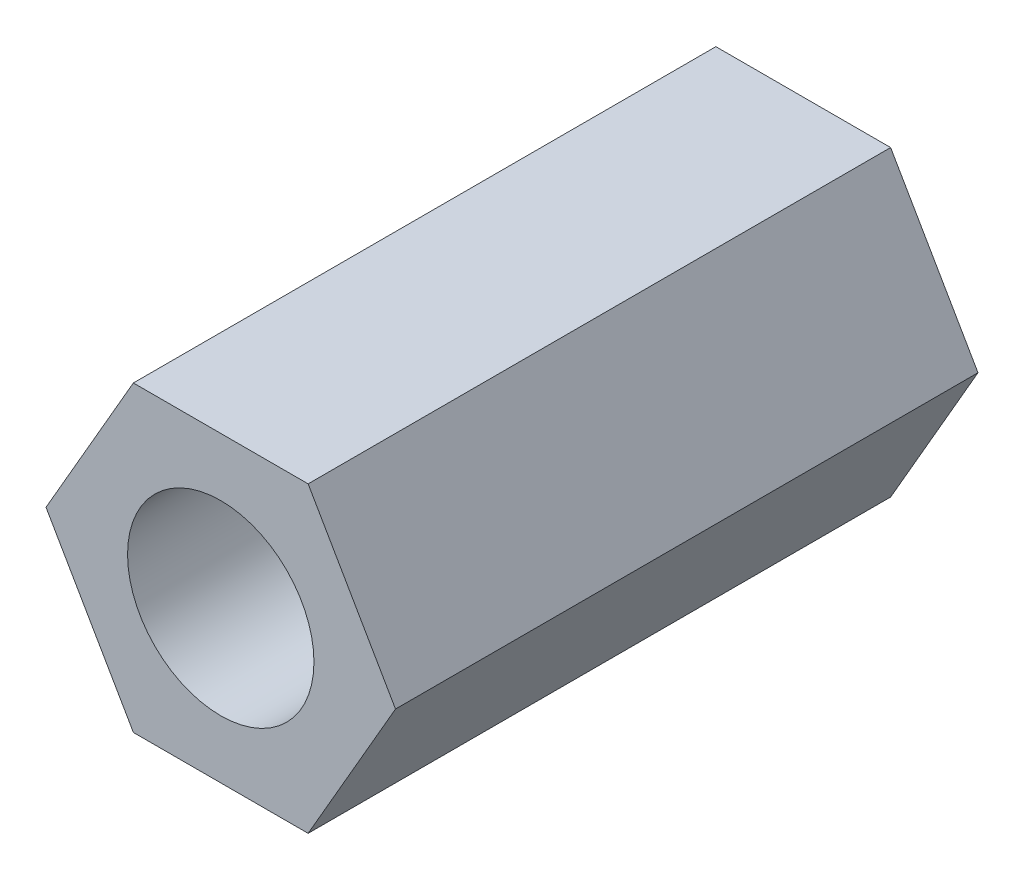
ISO-10303-21;
HEADER;
FILE_DESCRIPTION(('STEP AP214'),'2;1');
FILE_NAME('part.step','',(''),(''),'','','');
FILE_SCHEMA(('AUTOMOTIVE_DESIGN { 1 0 10303 214 1 1 1 1 }'));
ENDSEC;
DATA;
#1=APPLICATION_CONTEXT('core data for automotive mechanical design processes');
#2=APPLICATION_PROTOCOL_DEFINITION('international standard','automotive_design',2000,#1);
#3=PRODUCT_CONTEXT('',#1,'mechanical');
#4=PRODUCT('Part','Part','',(#3));
#5=PRODUCT_RELATED_PRODUCT_CATEGORY('part','',(#4));
#6=PRODUCT_DEFINITION_FORMATION('','',#4);
#7=PRODUCT_DEFINITION_CONTEXT('part definition',#1,'design');
#8=PRODUCT_DEFINITION('design','',#6,#7);
#9=PRODUCT_DEFINITION_SHAPE('','',#8);
#10=(LENGTH_UNIT() NAMED_UNIT(*) SI_UNIT(.MILLI.,.METRE.));
#11=(NAMED_UNIT(*) PLANE_ANGLE_UNIT() SI_UNIT($,.RADIAN.));
#12=(NAMED_UNIT(*) SI_UNIT($,.STERADIAN.) SOLID_ANGLE_UNIT());
#13=UNCERTAINTY_MEASURE_WITH_UNIT(LENGTH_MEASURE(1.E-05),#10,'distance_accuracy_value','');
#14=(GEOMETRIC_REPRESENTATION_CONTEXT(3) GLOBAL_UNCERTAINTY_ASSIGNED_CONTEXT((#13)) GLOBAL_UNIT_ASSIGNED_CONTEXT((#10,
#11,#12)) REPRESENTATION_CONTEXT('',''));
#15=CARTESIAN_POINT('',(0.,0.,0.));
#16=DIRECTION('',(0.,0.,1.));
#17=DIRECTION('',(1.,0.,0.));
#18=AXIS2_PLACEMENT_3D('',#15,#16,#17);
#19=CARTESIAN_POINT('',(0.,0.,10.));
#20=DIRECTION('',(0.,0.,1.));
#21=DIRECTION('',(1.,0.,0.));
#22=AXIS2_PLACEMENT_3D('',#19,#20,#21);
#23=PLANE('',#22);
#24=DIRECTION('',(0.5,0.866025403784438,0.));
#25=VECTOR('',#24,1.);
#26=CARTESIAN_POINT('',(1.5,-2.59807621135332,10.));
#27=LINE('',#26,#25);
#28=CARTESIAN_POINT('',(1.5,-2.59807621135332,10.));
#29=VERTEX_POINT('',#28);
#30=CARTESIAN_POINT('',(3.,0.,10.));
#31=VERTEX_POINT('',#30);
#32=EDGE_CURVE('E150',#29,#31,#27,.T.);
#33=ORIENTED_EDGE('',*,*,#32,.T.);
#34=DIRECTION('',(-0.5,0.866025403784439,0.));
#35=VECTOR('',#34,1.);
#36=CARTESIAN_POINT('',(3.,0.,10.));
#37=LINE('',#36,#35);
#38=CARTESIAN_POINT('',(1.5,2.59807621135332,10.));
#39=VERTEX_POINT('',#38);
#40=EDGE_CURVE('E98',#31,#39,#37,.T.);
#41=ORIENTED_EDGE('',*,*,#40,.T.);
#42=DIRECTION('',(-1.,0.,0.));
#43=VECTOR('',#42,1.);
#44=CARTESIAN_POINT('',(1.5,2.59807621135332,10.));
#45=LINE('',#44,#43);
#46=CARTESIAN_POINT('',(-1.5,2.59807621135332,10.));
#47=VERTEX_POINT('',#46);
#48=EDGE_CURVE('E111',#39,#47,#45,.T.);
#49=ORIENTED_EDGE('',*,*,#48,.T.);
#50=DIRECTION('',(-0.5,-0.866025403784439,0.));
#51=VECTOR('',#50,1.);
#52=CARTESIAN_POINT('',(-1.5,2.59807621135332,10.));
#53=LINE('',#52,#51);
#54=CARTESIAN_POINT('',(-3.,0.,10.));
#55=VERTEX_POINT('',#54);
#56=EDGE_CURVE('E105',#47,#55,#53,.T.);
#57=ORIENTED_EDGE('',*,*,#56,.T.);
#58=DIRECTION('',(0.5,-0.866025403784439,0.));
#59=VECTOR('',#58,1.);
#60=CARTESIAN_POINT('',(-3.,0.,10.));
#61=LINE('',#60,#59);
#62=CARTESIAN_POINT('',(-1.5,-2.59807621135332,10.));
#63=VERTEX_POINT('',#62);
#64=EDGE_CURVE('E109',#55,#63,#61,.T.);
#65=ORIENTED_EDGE('',*,*,#64,.T.);
#66=DIRECTION('',(1.,0.,0.));
#67=VECTOR('',#66,1.);
#68=CARTESIAN_POINT('',(-1.5,-2.59807621135332,10.));
#69=LINE('',#68,#67);
#70=EDGE_CURVE('E61',#63,#29,#69,.T.);
#71=ORIENTED_EDGE('',*,*,#70,.T.);
#72=EDGE_LOOP('',(#33,#41,#49,#57,#65,#71));
#73=FACE_BOUND('',#72,.T.);
#74=CARTESIAN_POINT('',(0.,0.,10.));
#75=DIRECTION('',(0.,0.,1.));
#76=DIRECTION('',(1.,0.,0.));
#77=AXIS2_PLACEMENT_3D('',#74,#75,#76);
#78=CIRCLE('',#77,1.6);
#79=CARTESIAN_POINT('',(1.6,0.,10.));
#80=VERTEX_POINT('',#79);
#81=EDGE_CURVE('E138',#80,#80,#78,.T.);
#82=ORIENTED_EDGE('',*,*,#81,.F.);
#83=EDGE_LOOP('',(#82));
#84=FACE_BOUND('',#83,.T.);
#85=ADVANCED_FACE('F43',(#73,#84),#23,.T.);
#86=CARTESIAN_POINT('',(0.,0.,0.));
#87=DIRECTION('',(0.,0.,1.));
#88=DIRECTION('',(1.,0.,0.));
#89=AXIS2_PLACEMENT_3D('',#86,#87,#88);
#90=PLANE('',#89);
#91=DIRECTION('',(0.5,0.866025403784438,0.));
#92=VECTOR('',#91,1.);
#93=CARTESIAN_POINT('',(1.5,-2.59807621135332,0.));
#94=LINE('',#93,#92);
#95=CARTESIAN_POINT('',(1.5,-2.59807621135332,0.));
#96=VERTEX_POINT('',#95);
#97=CARTESIAN_POINT('',(3.,0.,0.));
#98=VERTEX_POINT('',#97);
#99=EDGE_CURVE('E133',#96,#98,#94,.T.);
#100=ORIENTED_EDGE('',*,*,#99,.F.);
#101=DIRECTION('',(1.,0.,0.));
#102=VECTOR('',#101,1.);
#103=CARTESIAN_POINT('',(-1.5,-2.59807621135332,0.));
#104=LINE('',#103,#102);
#105=CARTESIAN_POINT('',(-1.5,-2.59807621135332,0.));
#106=VERTEX_POINT('',#105);
#107=EDGE_CURVE('E90',#106,#96,#104,.T.);
#108=ORIENTED_EDGE('',*,*,#107,.F.);
#109=DIRECTION('',(0.5,-0.866025403784439,0.));
#110=VECTOR('',#109,1.);
#111=CARTESIAN_POINT('',(-3.,0.,0.));
#112=LINE('',#111,#110);
#113=CARTESIAN_POINT('',(-3.,0.,0.));
#114=VERTEX_POINT('',#113);
#115=EDGE_CURVE('E84',#114,#106,#112,.T.);
#116=ORIENTED_EDGE('',*,*,#115,.F.);
#117=DIRECTION('',(-0.5,-0.866025403784439,0.));
#118=VECTOR('',#117,1.);
#119=CARTESIAN_POINT('',(-1.5,2.59807621135332,0.));
#120=LINE('',#119,#118);
#121=CARTESIAN_POINT('',(-1.5,2.59807621135332,0.));
#122=VERTEX_POINT('',#121);
#123=EDGE_CURVE('E120',#122,#114,#120,.T.);
#124=ORIENTED_EDGE('',*,*,#123,.F.);
#125=DIRECTION('',(-1.,0.,0.));
#126=VECTOR('',#125,1.);
#127=CARTESIAN_POINT('',(1.5,2.59807621135332,0.));
#128=LINE('',#127,#126);
#129=CARTESIAN_POINT('',(1.5,2.59807621135332,0.));
#130=VERTEX_POINT('',#129);
#131=EDGE_CURVE('E141',#130,#122,#128,.T.);
#132=ORIENTED_EDGE('',*,*,#131,.F.);
#133=DIRECTION('',(-0.5,0.866025403784439,0.));
#134=VECTOR('',#133,1.);
#135=CARTESIAN_POINT('',(3.,0.,0.));
#136=LINE('',#135,#134);
#137=EDGE_CURVE('E137',#98,#130,#136,.T.);
#138=ORIENTED_EDGE('',*,*,#137,.F.);
#139=EDGE_LOOP('',(#100,#108,#116,#124,#132,#138));
#140=FACE_BOUND('',#139,.T.);
#141=CARTESIAN_POINT('',(0.,0.,0.));
#142=DIRECTION('',(0.,0.,1.));
#143=DIRECTION('',(1.,0.,0.));
#144=AXIS2_PLACEMENT_3D('',#141,#142,#143);
#145=CIRCLE('',#144,1.6);
#146=CARTESIAN_POINT('',(1.6,0.,0.));
#147=VERTEX_POINT('',#146);
#148=EDGE_CURVE('E265',#147,#147,#145,.T.);
#149=ORIENTED_EDGE('',*,*,#148,.T.);
#150=EDGE_LOOP('',(#149));
#151=FACE_BOUND('',#150,.T.);
#152=ADVANCED_FACE('F163',(#140,#151),#90,.F.);
#153=CARTESIAN_POINT('',(1.5,-2.59807621135332,10.));
#154=DIRECTION('',(-0.866025403784439,0.5,0.));
#155=DIRECTION('',(-0.5,-0.866025403784439,0.));
#156=AXIS2_PLACEMENT_3D('',#153,#154,#155);
#157=PLANE('',#156);
#158=ORIENTED_EDGE('',*,*,#99,.T.);
#159=DIRECTION('',(0.,0.,-1.));
#160=VECTOR('',#159,1.);
#161=CARTESIAN_POINT('',(3.,0.,10.));
#162=LINE('',#161,#160);
#163=EDGE_CURVE('E11',#31,#98,#162,.T.);
#164=ORIENTED_EDGE('',*,*,#163,.F.);
#165=ORIENTED_EDGE('',*,*,#32,.F.);
#166=DIRECTION('',(0.,0.,-1.));
#167=VECTOR('',#166,1.);
#168=CARTESIAN_POINT('',(1.5,-2.59807621135332,10.));
#169=LINE('',#168,#167);
#170=EDGE_CURVE('E129',#29,#96,#169,.T.);
#171=ORIENTED_EDGE('',*,*,#170,.T.);
#172=EDGE_LOOP('',(#158,#164,#165,#171));
#173=FACE_BOUND('',#172,.T.);
#174=ADVANCED_FACE('F45',(#173),#157,.F.);
#175=CARTESIAN_POINT('',(3.,0.,10.));
#176=DIRECTION('',(-0.866025403784439,-0.5,0.));
#177=DIRECTION('',(0.5,-0.866025403784439,0.));
#178=AXIS2_PLACEMENT_3D('',#175,#176,#177);
#179=PLANE('',#178);
#180=ORIENTED_EDGE('',*,*,#137,.T.);
#181=DIRECTION('',(0.,0.,-1.));
#182=VECTOR('',#181,1.);
#183=CARTESIAN_POINT('',(1.5,2.59807621135332,10.));
#184=LINE('',#183,#182);
#185=EDGE_CURVE('E53',#39,#130,#184,.T.);
#186=ORIENTED_EDGE('',*,*,#185,.F.);
#187=ORIENTED_EDGE('',*,*,#40,.F.);
#188=ORIENTED_EDGE('',*,*,#163,.T.);
#189=EDGE_LOOP('',(#180,#186,#187,#188));
#190=FACE_BOUND('',#189,.T.);
#191=ADVANCED_FACE('F188',(#190),#179,.F.);
#192=CARTESIAN_POINT('',(1.5,2.59807621135332,10.));
#193=DIRECTION('',(0.,-1.,0.));
#194=DIRECTION('',(1.,0.,0.));
#195=AXIS2_PLACEMENT_3D('',#192,#193,#194);
#196=PLANE('',#195);
#197=ORIENTED_EDGE('',*,*,#131,.T.);
#198=DIRECTION('',(0.,0.,-1.));
#199=VECTOR('',#198,1.);
#200=CARTESIAN_POINT('',(-1.5,2.59807621135332,10.));
#201=LINE('',#200,#199);
#202=EDGE_CURVE('E122',#47,#122,#201,.T.);
#203=ORIENTED_EDGE('',*,*,#202,.F.);
#204=ORIENTED_EDGE('',*,*,#48,.F.);
#205=ORIENTED_EDGE('',*,*,#185,.T.);
#206=EDGE_LOOP('',(#197,#203,#204,#205));
#207=FACE_BOUND('',#206,.T.);
#208=ADVANCED_FACE('F160',(#207),#196,.F.);
#209=CARTESIAN_POINT('',(-1.5,2.59807621135332,10.));
#210=DIRECTION('',(0.866025403784439,-0.5,0.));
#211=DIRECTION('',(0.5,0.866025403784439,0.));
#212=AXIS2_PLACEMENT_3D('',#209,#210,#211);
#213=PLANE('',#212);
#214=ORIENTED_EDGE('',*,*,#123,.T.);
#215=DIRECTION('',(0.,0.,-1.));
#216=VECTOR('',#215,1.);
#217=CARTESIAN_POINT('',(-3.,0.,10.));
#218=LINE('',#217,#216);
#219=EDGE_CURVE('E117',#55,#114,#218,.T.);
#220=ORIENTED_EDGE('',*,*,#219,.F.);
#221=ORIENTED_EDGE('',*,*,#56,.F.);
#222=ORIENTED_EDGE('',*,*,#202,.T.);
#223=EDGE_LOOP('',(#214,#220,#221,#222));
#224=FACE_BOUND('',#223,.T.);
#225=ADVANCED_FACE('F118',(#224),#213,.F.);
#226=CARTESIAN_POINT('',(-3.,0.,10.));
#227=DIRECTION('',(0.866025403784439,0.5,0.));
#228=DIRECTION('',(-0.5,0.866025403784439,0.));
#229=AXIS2_PLACEMENT_3D('',#226,#227,#228);
#230=PLANE('',#229);
#231=ORIENTED_EDGE('',*,*,#115,.T.);
#232=DIRECTION('',(0.,0.,-1.));
#233=VECTOR('',#232,1.);
#234=CARTESIAN_POINT('',(-1.5,-2.59807621135332,10.));
#235=LINE('',#234,#233);
#236=EDGE_CURVE('E123',#63,#106,#235,.T.);
#237=ORIENTED_EDGE('',*,*,#236,.F.);
#238=ORIENTED_EDGE('',*,*,#64,.F.);
#239=ORIENTED_EDGE('',*,*,#219,.T.);
#240=EDGE_LOOP('',(#231,#237,#238,#239));
#241=FACE_BOUND('',#240,.T.);
#242=ADVANCED_FACE('F125',(#241),#230,.F.);
#243=CARTESIAN_POINT('',(-1.5,-2.59807621135332,10.));
#244=DIRECTION('',(0.,1.,0.));
#245=DIRECTION('',(0.,0.,1.));
#246=AXIS2_PLACEMENT_3D('',#243,#244,#245);
#247=PLANE('',#246);
#248=ORIENTED_EDGE('',*,*,#107,.T.);
#249=ORIENTED_EDGE('',*,*,#170,.F.);
#250=ORIENTED_EDGE('',*,*,#70,.F.);
#251=ORIENTED_EDGE('',*,*,#236,.T.);
#252=EDGE_LOOP('',(#248,#249,#250,#251));
#253=FACE_BOUND('',#252,.T.);
#254=ADVANCED_FACE('F168',(#253),#247,.F.);
#255=CARTESIAN_POINT('',(0.,0.,10.));
#256=DIRECTION('',(0.,0.,-1.));
#257=DIRECTION('',(-1.,0.,0.));
#258=AXIS2_PLACEMENT_3D('',#255,#256,#257);
#259=CYLINDRICAL_SURFACE('',#258,1.6);
#260=ORIENTED_EDGE('',*,*,#81,.T.);
#261=EDGE_LOOP('',(#260));
#262=FACE_BOUND('',#261,.T.);
#263=ORIENTED_EDGE('',*,*,#148,.F.);
#264=EDGE_LOOP('',(#263));
#265=FACE_BOUND('',#264,.T.);
#266=ADVANCED_FACE('F170',(#262,#265),#259,.F.);
#267=CLOSED_SHELL('',(#85,#152,#174,#191,#208,#225,#242,#254,#266));
#268=MANIFOLD_SOLID_BREP('B2',#267);
#269=ADVANCED_BREP_SHAPE_REPRESENTATION('',(#18,#268),#14);
#270=SHAPE_DEFINITION_REPRESENTATION(#9,#269);
ENDSEC;
END-ISO-10303-21;
